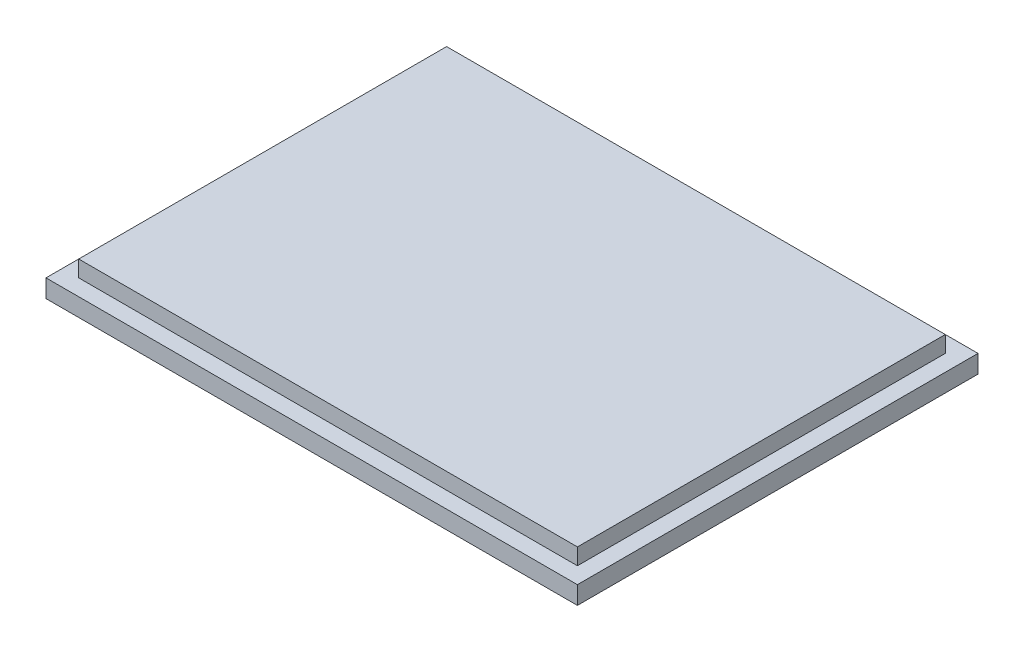
ISO-10303-21;
HEADER;
FILE_DESCRIPTION(('STEP AP214'),'2;1');
FILE_NAME('part.step','',(''),(''),'','','');
FILE_SCHEMA(('AUTOMOTIVE_DESIGN { 1 0 10303 214 1 1 1 1 }'));
ENDSEC;
DATA;
#1=APPLICATION_CONTEXT('core data for automotive mechanical design processes');
#2=APPLICATION_PROTOCOL_DEFINITION('international standard','automotive_design',2000,#1);
#3=PRODUCT_CONTEXT('',#1,'mechanical');
#4=PRODUCT('Part','Part','',(#3));
#5=PRODUCT_RELATED_PRODUCT_CATEGORY('part','',(#4));
#6=PRODUCT_DEFINITION_FORMATION('','',#4);
#7=PRODUCT_DEFINITION_CONTEXT('part definition',#1,'design');
#8=PRODUCT_DEFINITION('design','',#6,#7);
#9=PRODUCT_DEFINITION_SHAPE('','',#8);
#10=(LENGTH_UNIT() NAMED_UNIT(*) SI_UNIT(.MILLI.,.METRE.));
#11=(NAMED_UNIT(*) PLANE_ANGLE_UNIT() SI_UNIT($,.RADIAN.));
#12=(NAMED_UNIT(*) SI_UNIT($,.STERADIAN.) SOLID_ANGLE_UNIT());
#13=UNCERTAINTY_MEASURE_WITH_UNIT(LENGTH_MEASURE(1.E-05),#10,'distance_accuracy_value','');
#14=(GEOMETRIC_REPRESENTATION_CONTEXT(3) GLOBAL_UNCERTAINTY_ASSIGNED_CONTEXT((#13)) GLOBAL_UNIT_ASSIGNED_CONTEXT((#10,
#11,#12)) REPRESENTATION_CONTEXT('',''));
#15=CARTESIAN_POINT('',(0.,0.,0.));
#16=DIRECTION('',(0.,0.,1.));
#17=DIRECTION('',(1.,0.,0.));
#18=AXIS2_PLACEMENT_3D('',#15,#16,#17);
#19=CARTESIAN_POINT('',(-162.5,11.,-122.5));
#20=DIRECTION('',(1.,0.,0.));
#21=DIRECTION('',(0.,0.,-1.));
#22=AXIS2_PLACEMENT_3D('',#19,#20,#21);
#23=PLANE('',#22);
#24=DIRECTION('',(0.,0.,1.));
#25=VECTOR('',#24,1.);
#26=CARTESIAN_POINT('',(-162.5,0.,-122.5));
#27=LINE('',#26,#25);
#28=CARTESIAN_POINT('',(-162.5,0.,-122.5));
#29=VERTEX_POINT('',#28);
#30=CARTESIAN_POINT('',(-162.5,0.,122.5));
#31=VERTEX_POINT('',#30);
#32=EDGE_CURVE('E104',#29,#31,#27,.T.);
#33=ORIENTED_EDGE('',*,*,#32,.T.);
#34=DIRECTION('',(0.,-1.,0.));
#35=VECTOR('',#34,1.);
#36=CARTESIAN_POINT('',(-162.5,11.,122.5));
#37=LINE('',#36,#35);
#38=CARTESIAN_POINT('',(-162.5,11.,122.5));
#39=VERTEX_POINT('',#38);
#40=EDGE_CURVE('E11',#39,#31,#37,.T.);
#41=ORIENTED_EDGE('',*,*,#40,.F.);
#42=DIRECTION('',(0.,0.,1.));
#43=VECTOR('',#42,1.);
#44=CARTESIAN_POINT('',(-162.5,11.,-122.5));
#45=LINE('',#44,#43);
#46=CARTESIAN_POINT('',(-162.5,11.,-122.5));
#47=VERTEX_POINT('',#46);
#48=EDGE_CURVE('E133',#47,#39,#45,.T.);
#49=ORIENTED_EDGE('',*,*,#48,.F.);
#50=DIRECTION('',(0.,-1.,0.));
#51=VECTOR('',#50,1.);
#52=CARTESIAN_POINT('',(-162.5,11.,-122.5));
#53=LINE('',#52,#51);
#54=EDGE_CURVE('E145',#47,#29,#53,.T.);
#55=ORIENTED_EDGE('',*,*,#54,.T.);
#56=EDGE_LOOP('',(#33,#41,#49,#55));
#57=FACE_BOUND('',#56,.T.);
#58=ADVANCED_FACE('F33',(#57),#23,.F.);
#59=CARTESIAN_POINT('',(-162.5,11.,122.5));
#60=DIRECTION('',(0.,0.,-1.));
#61=DIRECTION('',(-1.,0.,0.));
#62=AXIS2_PLACEMENT_3D('',#59,#60,#61);
#63=PLANE('',#62);
#64=DIRECTION('',(1.,0.,0.));
#65=VECTOR('',#64,1.);
#66=CARTESIAN_POINT('',(-162.5,0.,122.5));
#67=LINE('',#66,#65);
#68=CARTESIAN_POINT('',(162.5,0.,122.5));
#69=VERTEX_POINT('',#68);
#70=EDGE_CURVE('E148',#31,#69,#67,.T.);
#71=ORIENTED_EDGE('',*,*,#70,.T.);
#72=DIRECTION('',(0.,-1.,0.));
#73=VECTOR('',#72,1.);
#74=CARTESIAN_POINT('',(162.5,11.,122.5));
#75=LINE('',#74,#73);
#76=CARTESIAN_POINT('',(162.5,11.,122.5));
#77=VERTEX_POINT('',#76);
#78=EDGE_CURVE('E40',#77,#69,#75,.T.);
#79=ORIENTED_EDGE('',*,*,#78,.F.);
#80=DIRECTION('',(1.,0.,0.));
#81=VECTOR('',#80,1.);
#82=CARTESIAN_POINT('',(-162.5,11.,122.5));
#83=LINE('',#82,#81);
#84=EDGE_CURVE('E136',#39,#77,#83,.T.);
#85=ORIENTED_EDGE('',*,*,#84,.F.);
#86=ORIENTED_EDGE('',*,*,#40,.T.);
#87=EDGE_LOOP('',(#71,#79,#85,#86));
#88=FACE_BOUND('',#87,.T.);
#89=ADVANCED_FACE('F164',(#88),#63,.F.);
#90=CARTESIAN_POINT('',(162.5,11.,-122.5));
#91=DIRECTION('',(1.,0.,0.));
#92=DIRECTION('',(0.,0.,-1.));
#93=AXIS2_PLACEMENT_3D('',#90,#91,#92);
#94=PLANE('',#93);
#95=DIRECTION('',(0.,0.,1.));
#96=VECTOR('',#95,1.);
#97=CARTESIAN_POINT('',(162.5,0.,-122.5));
#98=LINE('',#97,#96);
#99=CARTESIAN_POINT('',(162.5,0.,-122.5));
#100=VERTEX_POINT('',#99);
#101=EDGE_CURVE('E151',#100,#69,#98,.T.);
#102=ORIENTED_EDGE('',*,*,#101,.F.);
#103=DIRECTION('',(0.,-1.,0.));
#104=VECTOR('',#103,1.);
#105=CARTESIAN_POINT('',(162.5,11.,-122.5));
#106=LINE('',#105,#104);
#107=CARTESIAN_POINT('',(162.5,11.,-122.5));
#108=VERTEX_POINT('',#107);
#109=EDGE_CURVE('E157',#108,#100,#106,.T.);
#110=ORIENTED_EDGE('',*,*,#109,.F.);
#111=DIRECTION('',(0.,0.,1.));
#112=VECTOR('',#111,1.);
#113=CARTESIAN_POINT('',(162.5,11.,-122.5));
#114=LINE('',#113,#112);
#115=EDGE_CURVE('E139',#108,#77,#114,.T.);
#116=ORIENTED_EDGE('',*,*,#115,.T.);
#117=ORIENTED_EDGE('',*,*,#78,.T.);
#118=EDGE_LOOP('',(#102,#110,#116,#117));
#119=FACE_BOUND('',#118,.T.);
#120=ADVANCED_FACE('F161',(#119),#94,.T.);
#121=CARTESIAN_POINT('',(-162.5,11.,-122.5));
#122=DIRECTION('',(0.,0.,-1.));
#123=DIRECTION('',(-1.,0.,0.));
#124=AXIS2_PLACEMENT_3D('',#121,#122,#123);
#125=PLANE('',#124);
#126=DIRECTION('',(1.,0.,0.));
#127=VECTOR('',#126,1.);
#128=CARTESIAN_POINT('',(-162.5,0.,-122.5));
#129=LINE('',#128,#127);
#130=EDGE_CURVE('E137',#29,#100,#129,.T.);
#131=ORIENTED_EDGE('',*,*,#130,.F.);
#132=ORIENTED_EDGE('',*,*,#54,.F.);
#133=DIRECTION('',(1.,0.,0.));
#134=VECTOR('',#133,1.);
#135=CARTESIAN_POINT('',(-162.5,11.,-122.5));
#136=LINE('',#135,#134);
#137=EDGE_CURVE('E142',#47,#108,#136,.T.);
#138=ORIENTED_EDGE('',*,*,#137,.T.);
#139=ORIENTED_EDGE('',*,*,#109,.T.);
#140=EDGE_LOOP('',(#131,#132,#138,#139));
#141=FACE_BOUND('',#140,.T.);
#142=ADVANCED_FACE('F171',(#141),#125,.T.);
#143=CARTESIAN_POINT('',(0.,11.,0.));
#144=DIRECTION('',(0.,1.,0.));
#145=DIRECTION('',(0.,0.,1.));
#146=AXIS2_PLACEMENT_3D('',#143,#144,#145);
#147=PLANE('',#146);
#148=DIRECTION('',(1.,0.,0.));
#149=VECTOR('',#148,1.);
#150=CARTESIAN_POINT('',(0.,11.,-112.5));
#151=LINE('',#150,#149);
#152=CARTESIAN_POINT('',(-152.5,11.,-112.5));
#153=VERTEX_POINT('',#152);
#154=CARTESIAN_POINT('',(152.5,11.,-112.5));
#155=VERTEX_POINT('',#154);
#156=EDGE_CURVE('E102',#153,#155,#151,.T.);
#157=ORIENTED_EDGE('',*,*,#156,.T.);
#158=DIRECTION('',(0.,0.,1.));
#159=VECTOR('',#158,1.);
#160=CARTESIAN_POINT('',(152.5,11.,0.));
#161=LINE('',#160,#159);
#162=CARTESIAN_POINT('',(152.5,11.,112.5));
#163=VERTEX_POINT('',#162);
#164=EDGE_CURVE('E118',#155,#163,#161,.T.);
#165=ORIENTED_EDGE('',*,*,#164,.T.);
#166=DIRECTION('',(1.,0.,0.));
#167=VECTOR('',#166,1.);
#168=CARTESIAN_POINT('',(0.,11.,112.5));
#169=LINE('',#168,#167);
#170=CARTESIAN_POINT('',(-152.5,11.,112.5));
#171=VERTEX_POINT('',#170);
#172=EDGE_CURVE('E52',#171,#163,#169,.T.);
#173=ORIENTED_EDGE('',*,*,#172,.F.);
#174=DIRECTION('',(0.,0.,1.));
#175=VECTOR('',#174,1.);
#176=CARTESIAN_POINT('',(-152.5,11.,0.));
#177=LINE('',#176,#175);
#178=EDGE_CURVE('E47',#153,#171,#177,.T.);
#179=ORIENTED_EDGE('',*,*,#178,.F.);
#180=EDGE_LOOP('',(#157,#165,#173,#179));
#181=FACE_BOUND('',#180,.T.);
#182=ORIENTED_EDGE('',*,*,#48,.T.);
#183=ORIENTED_EDGE('',*,*,#84,.T.);
#184=ORIENTED_EDGE('',*,*,#115,.F.);
#185=ORIENTED_EDGE('',*,*,#137,.F.);
#186=EDGE_LOOP('',(#182,#183,#184,#185));
#187=FACE_BOUND('',#186,.T.);
#188=ADVANCED_FACE('F175',(#181,#187),#147,.T.);
#189=CARTESIAN_POINT('',(0.,0.,0.));
#190=DIRECTION('',(0.,1.,0.));
#191=DIRECTION('',(0.,0.,1.));
#192=AXIS2_PLACEMENT_3D('',#189,#190,#191);
#193=PLANE('',#192);
#194=ORIENTED_EDGE('',*,*,#32,.F.);
#195=ORIENTED_EDGE('',*,*,#130,.T.);
#196=ORIENTED_EDGE('',*,*,#101,.T.);
#197=ORIENTED_EDGE('',*,*,#70,.F.);
#198=EDGE_LOOP('',(#194,#195,#196,#197));
#199=FACE_BOUND('',#198,.T.);
#200=ADVANCED_FACE('F168',(#199),#193,.F.);
#201=CARTESIAN_POINT('',(0.,21.,-112.5));
#202=DIRECTION('',(0.,0.,-1.));
#203=DIRECTION('',(-1.,0.,0.));
#204=AXIS2_PLACEMENT_3D('',#201,#202,#203);
#205=PLANE('',#204);
#206=ORIENTED_EDGE('',*,*,#156,.F.);
#207=DIRECTION('',(0.,-1.,0.));
#208=VECTOR('',#207,1.);
#209=CARTESIAN_POINT('',(-152.5,21.,-112.5));
#210=LINE('',#209,#208);
#211=CARTESIAN_POINT('',(-152.5,21.,-112.5));
#212=VERTEX_POINT('',#211);
#213=EDGE_CURVE('E95',#212,#153,#210,.T.);
#214=ORIENTED_EDGE('',*,*,#213,.F.);
#215=DIRECTION('',(1.,0.,0.));
#216=VECTOR('',#215,1.);
#217=CARTESIAN_POINT('',(0.,21.,-112.5));
#218=LINE('',#217,#216);
#219=CARTESIAN_POINT('',(152.5,21.,-112.5));
#220=VERTEX_POINT('',#219);
#221=EDGE_CURVE('E100',#212,#220,#218,.T.);
#222=ORIENTED_EDGE('',*,*,#221,.T.);
#223=DIRECTION('',(0.,-1.,0.));
#224=VECTOR('',#223,1.);
#225=CARTESIAN_POINT('',(152.5,21.,-112.5));
#226=LINE('',#225,#224);
#227=EDGE_CURVE('E124',#220,#155,#226,.T.);
#228=ORIENTED_EDGE('',*,*,#227,.T.);
#229=EDGE_LOOP('',(#206,#214,#222,#228));
#230=FACE_BOUND('',#229,.T.);
#231=ADVANCED_FACE('F97',(#230),#205,.T.);
#232=CARTESIAN_POINT('',(-152.5,21.,0.));
#233=DIRECTION('',(1.,0.,0.));
#234=DIRECTION('',(0.,0.,-1.));
#235=AXIS2_PLACEMENT_3D('',#232,#233,#234);
#236=PLANE('',#235);
#237=ORIENTED_EDGE('',*,*,#178,.T.);
#238=DIRECTION('',(0.,-1.,0.));
#239=VECTOR('',#238,1.);
#240=CARTESIAN_POINT('',(-152.5,21.,112.5));
#241=LINE('',#240,#239);
#242=CARTESIAN_POINT('',(-152.5,21.,112.5));
#243=VERTEX_POINT('',#242);
#244=EDGE_CURVE('E105',#243,#171,#241,.T.);
#245=ORIENTED_EDGE('',*,*,#244,.F.);
#246=DIRECTION('',(0.,0.,1.));
#247=VECTOR('',#246,1.);
#248=CARTESIAN_POINT('',(-152.5,21.,0.));
#249=LINE('',#248,#247);
#250=EDGE_CURVE('E108',#212,#243,#249,.T.);
#251=ORIENTED_EDGE('',*,*,#250,.F.);
#252=ORIENTED_EDGE('',*,*,#213,.T.);
#253=EDGE_LOOP('',(#237,#245,#251,#252));
#254=FACE_BOUND('',#253,.T.);
#255=ADVANCED_FACE('F109',(#254),#236,.F.);
#256=CARTESIAN_POINT('',(0.,21.,112.5));
#257=DIRECTION('',(0.,0.,-1.));
#258=DIRECTION('',(-1.,0.,0.));
#259=AXIS2_PLACEMENT_3D('',#256,#257,#258);
#260=PLANE('',#259);
#261=ORIENTED_EDGE('',*,*,#172,.T.);
#262=DIRECTION('',(0.,-1.,0.));
#263=VECTOR('',#262,1.);
#264=CARTESIAN_POINT('',(152.5,21.,112.5));
#265=LINE('',#264,#263);
#266=CARTESIAN_POINT('',(152.5,21.,112.5));
#267=VERTEX_POINT('',#266);
#268=EDGE_CURVE('E129',#267,#163,#265,.T.);
#269=ORIENTED_EDGE('',*,*,#268,.F.);
#270=DIRECTION('',(1.,0.,0.));
#271=VECTOR('',#270,1.);
#272=CARTESIAN_POINT('',(0.,21.,112.5));
#273=LINE('',#272,#271);
#274=EDGE_CURVE('E113',#243,#267,#273,.T.);
#275=ORIENTED_EDGE('',*,*,#274,.F.);
#276=ORIENTED_EDGE('',*,*,#244,.T.);
#277=EDGE_LOOP('',(#261,#269,#275,#276));
#278=FACE_BOUND('',#277,.T.);
#279=ADVANCED_FACE('F196',(#278),#260,.F.);
#280=CARTESIAN_POINT('',(152.5,21.,0.));
#281=DIRECTION('',(1.,0.,0.));
#282=DIRECTION('',(0.,0.,-1.));
#283=AXIS2_PLACEMENT_3D('',#280,#281,#282);
#284=PLANE('',#283);
#285=ORIENTED_EDGE('',*,*,#164,.F.);
#286=ORIENTED_EDGE('',*,*,#227,.F.);
#287=DIRECTION('',(0.,0.,1.));
#288=VECTOR('',#287,1.);
#289=CARTESIAN_POINT('',(152.5,21.,0.));
#290=LINE('',#289,#288);
#291=EDGE_CURVE('E117',#220,#267,#290,.T.);
#292=ORIENTED_EDGE('',*,*,#291,.T.);
#293=ORIENTED_EDGE('',*,*,#268,.T.);
#294=EDGE_LOOP('',(#285,#286,#292,#293));
#295=FACE_BOUND('',#294,.T.);
#296=ADVANCED_FACE('F199',(#295),#284,.T.);
#297=CARTESIAN_POINT('',(0.,21.,0.));
#298=DIRECTION('',(0.,1.,0.));
#299=DIRECTION('',(0.,0.,1.));
#300=AXIS2_PLACEMENT_3D('',#297,#298,#299);
#301=PLANE('',#300);
#302=ORIENTED_EDGE('',*,*,#221,.F.);
#303=ORIENTED_EDGE('',*,*,#250,.T.);
#304=ORIENTED_EDGE('',*,*,#274,.T.);
#305=ORIENTED_EDGE('',*,*,#291,.F.);
#306=EDGE_LOOP('',(#302,#303,#304,#305));
#307=FACE_BOUND('',#306,.T.);
#308=ADVANCED_FACE('F115',(#307),#301,.T.);
#309=CLOSED_SHELL('',(#58,#89,#120,#142,#188,#200,#231,#255,#279,#296,#308));
#310=MANIFOLD_SOLID_BREP('B2',#309);
#311=ADVANCED_BREP_SHAPE_REPRESENTATION('',(#18,#310),#14);
#312=SHAPE_DEFINITION_REPRESENTATION(#9,#311);
ENDSEC;
END-ISO-10303-21;
